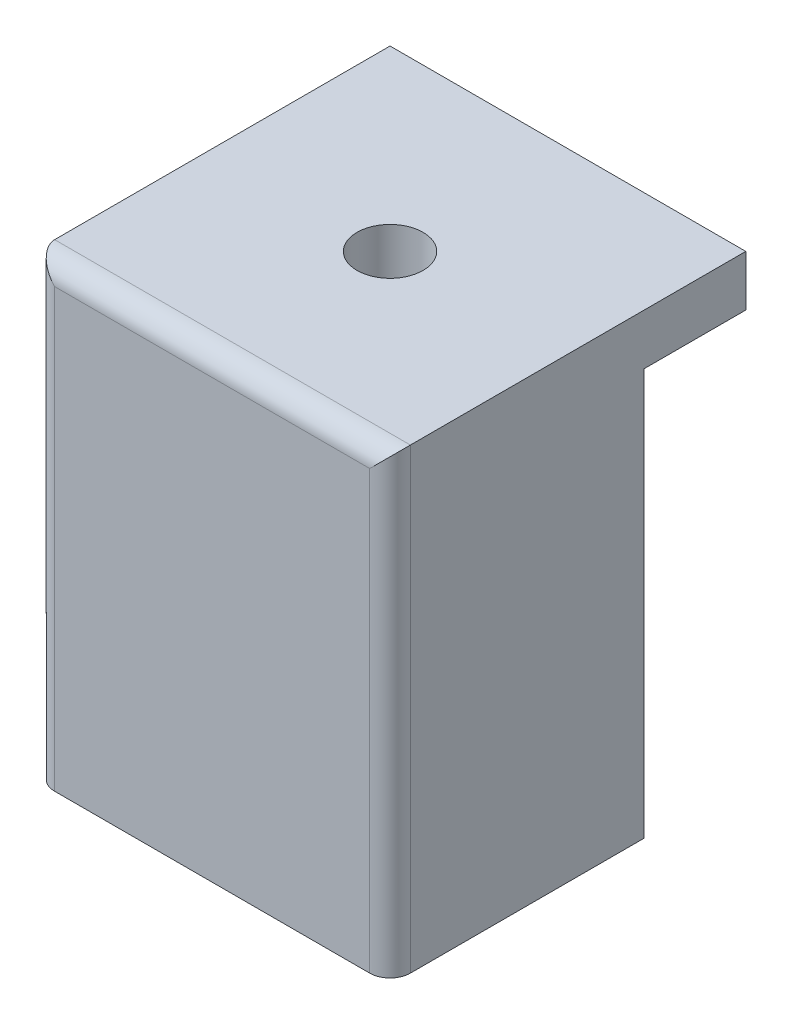
ISO-10303-21;
HEADER;
FILE_DESCRIPTION(('STEP AP214'),'2;1');
FILE_NAME('part.step','',(''),(''),'','','');
FILE_SCHEMA(('AUTOMOTIVE_DESIGN { 1 0 10303 214 1 1 1 1 }'));
ENDSEC;
DATA;
#1=APPLICATION_CONTEXT('core data for automotive mechanical design processes');
#2=APPLICATION_PROTOCOL_DEFINITION('international standard','automotive_design',2000,#1);
#3=PRODUCT_CONTEXT('',#1,'mechanical');
#4=PRODUCT('Part','Part','',(#3));
#5=PRODUCT_RELATED_PRODUCT_CATEGORY('part','',(#4));
#6=PRODUCT_DEFINITION_FORMATION('','',#4);
#7=PRODUCT_DEFINITION_CONTEXT('part definition',#1,'design');
#8=PRODUCT_DEFINITION('design','',#6,#7);
#9=PRODUCT_DEFINITION_SHAPE('','',#8);
#10=(LENGTH_UNIT() NAMED_UNIT(*) SI_UNIT(.MILLI.,.METRE.));
#11=(NAMED_UNIT(*) PLANE_ANGLE_UNIT() SI_UNIT($,.RADIAN.));
#12=(NAMED_UNIT(*) SI_UNIT($,.STERADIAN.) SOLID_ANGLE_UNIT());
#13=UNCERTAINTY_MEASURE_WITH_UNIT(LENGTH_MEASURE(1.E-05),#10,'distance_accuracy_value','');
#14=(GEOMETRIC_REPRESENTATION_CONTEXT(3) GLOBAL_UNCERTAINTY_ASSIGNED_CONTEXT((#13)) GLOBAL_UNIT_ASSIGNED_CONTEXT((#10,
#11,#12)) REPRESENTATION_CONTEXT('',''));
#15=CARTESIAN_POINT('',(0.,0.,0.));
#16=DIRECTION('',(0.,0.,1.));
#17=DIRECTION('',(1.,0.,0.));
#18=AXIS2_PLACEMENT_3D('',#15,#16,#17);
#19=CARTESIAN_POINT('',(7.5,45.,-7.5));
#20=DIRECTION('',(0.,0.,1.));
#21=DIRECTION('',(1.,0.,0.));
#22=AXIS2_PLACEMENT_3D('',#19,#20,#21);
#23=PLANE('',#22);
#24=DIRECTION('',(0.,-1.,0.));
#25=VECTOR('',#24,1.);
#26=CARTESIAN_POINT('',(-7.5,45.,-7.5));
#27=LINE('',#26,#25);
#28=CARTESIAN_POINT('',(-7.5,35.,-7.5));
#29=VERTEX_POINT('',#28);
#30=CARTESIAN_POINT('',(-7.5,20.,-7.5));
#31=VERTEX_POINT('',#30);
#32=EDGE_CURVE('E261',#29,#31,#27,.T.);
#33=ORIENTED_EDGE('',*,*,#32,.T.);
#34=DIRECTION('',(-1.,0.,0.));
#35=VECTOR('',#34,1.);
#36=CARTESIAN_POINT('',(7.5,20.,-7.5));
#37=LINE('',#36,#35);
#38=CARTESIAN_POINT('',(7.5,20.,-7.5));
#39=VERTEX_POINT('',#38);
#40=EDGE_CURVE('E201',#39,#31,#37,.T.);
#41=ORIENTED_EDGE('',*,*,#40,.F.);
#42=DIRECTION('',(0.,-1.,0.));
#43=VECTOR('',#42,1.);
#44=CARTESIAN_POINT('',(7.5,45.,-7.5));
#45=LINE('',#44,#43);
#46=CARTESIAN_POINT('',(7.5,35.,-7.5));
#47=VERTEX_POINT('',#46);
#48=EDGE_CURVE('E255',#47,#39,#45,.T.);
#49=ORIENTED_EDGE('',*,*,#48,.F.);
#50=DIRECTION('',(1.,0.,0.));
#51=VECTOR('',#50,1.);
#52=CARTESIAN_POINT('',(7.5,35.,-7.5));
#53=LINE('',#52,#51);
#54=EDGE_CURVE('E219',#29,#47,#53,.T.);
#55=ORIENTED_EDGE('',*,*,#54,.F.);
#56=EDGE_LOOP('',(#33,#41,#49,#55));
#57=FACE_BOUND('',#56,.T.);
#58=DIRECTION('',(-1.,0.,0.));
#59=VECTOR('',#58,1.);
#60=CARTESIAN_POINT('',(17.5,40.,-7.5));
#61=LINE('',#60,#59);
#62=CARTESIAN_POINT('',(17.5,40.,-7.5));
#63=VERTEX_POINT('',#62);
#64=CARTESIAN_POINT('',(-17.5,40.,-7.49999999999999));
#65=VERTEX_POINT('',#64);
#66=EDGE_CURVE('E176',#63,#65,#61,.T.);
#67=ORIENTED_EDGE('',*,*,#66,.F.);
#68=DIRECTION('',(0.,-1.,0.));
#69=VECTOR('',#68,1.);
#70=CARTESIAN_POINT('',(17.5,45.,-7.5));
#71=LINE('',#70,#69);
#72=CARTESIAN_POINT('',(17.5,0.,-7.5));
#73=VERTEX_POINT('',#72);
#74=EDGE_CURVE('E181',#63,#73,#71,.T.);
#75=ORIENTED_EDGE('',*,*,#74,.T.);
#76=DIRECTION('',(-1.,0.,0.));
#77=VECTOR('',#76,1.);
#78=CARTESIAN_POINT('',(7.5,0.,-7.5));
#79=LINE('',#78,#77);
#80=CARTESIAN_POINT('',(7.5,0.,-7.5));
#81=VERTEX_POINT('',#80);
#82=EDGE_CURVE('E232',#73,#81,#79,.T.);
#83=ORIENTED_EDGE('',*,*,#82,.T.);
#84=CARTESIAN_POINT('',(7.5,9.99999999999999,-7.5));
#85=VERTEX_POINT('',#84);
#86=EDGE_CURVE('E234',#85,#81,#45,.T.);
#87=ORIENTED_EDGE('',*,*,#86,.F.);
#88=DIRECTION('',(1.,0.,0.));
#89=VECTOR('',#88,1.);
#90=CARTESIAN_POINT('',(7.5,9.99999999999999,-7.5));
#91=LINE('',#90,#89);
#92=CARTESIAN_POINT('',(-7.5,10.,-7.5));
#93=VERTEX_POINT('',#92);
#94=EDGE_CURVE('E197',#93,#85,#91,.T.);
#95=ORIENTED_EDGE('',*,*,#94,.F.);
#96=CARTESIAN_POINT('',(-7.5,0.,-7.5));
#97=VERTEX_POINT('',#96);
#98=EDGE_CURVE('E260',#93,#97,#27,.T.);
#99=ORIENTED_EDGE('',*,*,#98,.T.);
#100=DIRECTION('',(-1.,0.,0.));
#101=VECTOR('',#100,1.);
#102=CARTESIAN_POINT('',(-17.5,0.,-7.5));
#103=LINE('',#102,#101);
#104=CARTESIAN_POINT('',(-17.5,0.,-7.5));
#105=VERTEX_POINT('',#104);
#106=EDGE_CURVE('E243',#97,#105,#103,.T.);
#107=ORIENTED_EDGE('',*,*,#106,.T.);
#108=DIRECTION('',(0.,-1.,0.));
#109=VECTOR('',#108,1.);
#110=CARTESIAN_POINT('',(-17.5,45.,-7.5));
#111=LINE('',#110,#109);
#112=EDGE_CURVE('E258',#65,#105,#111,.T.);
#113=ORIENTED_EDGE('',*,*,#112,.F.);
#114=EDGE_LOOP('',(#67,#75,#83,#87,#95,#99,#107,#113));
#115=FACE_BOUND('',#114,.T.);
#116=ADVANCED_FACE('F41',(#57,#115),#23,.F.);
#117=CARTESIAN_POINT('',(7.5,45.,-7.5));
#118=DIRECTION('',(1.,0.,0.));
#119=DIRECTION('',(0.,0.,-1.));
#120=AXIS2_PLACEMENT_3D('',#117,#118,#119);
#121=PLANE('',#120);
#122=DIRECTION('',(0.,0.,1.));
#123=VECTOR('',#122,1.);
#124=CARTESIAN_POINT('',(7.5,20.,-25.5277563773199));
#125=LINE('',#124,#123);
#126=CARTESIAN_POINT('',(7.5,20.,7.5));
#127=VERTEX_POINT('',#126);
#128=EDGE_CURVE('E207',#39,#127,#125,.T.);
#129=ORIENTED_EDGE('',*,*,#128,.T.);
#130=DIRECTION('',(0.,-1.,0.));
#131=VECTOR('',#130,1.);
#132=CARTESIAN_POINT('',(7.5,45.,7.5));
#133=LINE('',#132,#131);
#134=CARTESIAN_POINT('',(7.5,35.,7.5));
#135=VERTEX_POINT('',#134);
#136=EDGE_CURVE('E269',#135,#127,#133,.T.);
#137=ORIENTED_EDGE('',*,*,#136,.F.);
#138=DIRECTION('',(0.,0.,1.));
#139=VECTOR('',#138,1.);
#140=CARTESIAN_POINT('',(7.5,35.,-25.5277563773199));
#141=LINE('',#140,#139);
#142=EDGE_CURVE('E222',#47,#135,#141,.T.);
#143=ORIENTED_EDGE('',*,*,#142,.F.);
#144=ORIENTED_EDGE('',*,*,#48,.T.);
#145=EDGE_LOOP('',(#129,#137,#143,#144));
#146=FACE_BOUND('',#145,.T.);
#147=ADVANCED_FACE('F308',(#146),#121,.F.);
#148=DIRECTION('',(0.,0.,1.));
#149=VECTOR('',#148,1.);
#150=CARTESIAN_POINT('',(7.5,9.99999999999999,-25.5277563773199));
#151=LINE('',#150,#149);
#152=CARTESIAN_POINT('',(7.5,10.,7.5));
#153=VERTEX_POINT('',#152);
#154=EDGE_CURVE('E214',#85,#153,#151,.T.);
#155=ORIENTED_EDGE('',*,*,#154,.F.);
#156=ORIENTED_EDGE('',*,*,#86,.T.);
#157=DIRECTION('',(0.,0.,1.));
#158=VECTOR('',#157,1.);
#159=CARTESIAN_POINT('',(7.5,0.,-7.5));
#160=LINE('',#159,#158);
#161=CARTESIAN_POINT('',(7.5,0.,7.5));
#162=VERTEX_POINT('',#161);
#163=EDGE_CURVE('E221',#81,#162,#160,.T.);
#164=ORIENTED_EDGE('',*,*,#163,.T.);
#165=EDGE_CURVE('E268',#153,#162,#133,.T.);
#166=ORIENTED_EDGE('',*,*,#165,.F.);
#167=EDGE_LOOP('',(#155,#156,#164,#166));
#168=FACE_BOUND('',#167,.T.);
#169=ADVANCED_FACE('F314',(#168),#121,.F.);
#170=CARTESIAN_POINT('',(-7.5,45.,7.5));
#171=DIRECTION('',(0.,0.,1.));
#172=DIRECTION('',(1.,0.,0.));
#173=AXIS2_PLACEMENT_3D('',#170,#171,#172);
#174=PLANE('',#173);
#175=DIRECTION('',(1.,0.,0.));
#176=VECTOR('',#175,1.);
#177=CARTESIAN_POINT('',(7.5,20.,7.5));
#178=LINE('',#177,#176);
#179=CARTESIAN_POINT('',(-7.5,20.,7.5));
#180=VERTEX_POINT('',#179);
#181=EDGE_CURVE('E204',#180,#127,#178,.T.);
#182=ORIENTED_EDGE('',*,*,#181,.F.);
#183=DIRECTION('',(0.,-1.,0.));
#184=VECTOR('',#183,1.);
#185=CARTESIAN_POINT('',(-7.5,45.,7.5));
#186=LINE('',#185,#184);
#187=CARTESIAN_POINT('',(-7.5,35.,7.5));
#188=VERTEX_POINT('',#187);
#189=EDGE_CURVE('E265',#188,#180,#186,.T.);
#190=ORIENTED_EDGE('',*,*,#189,.F.);
#191=DIRECTION('',(-1.,0.,0.));
#192=VECTOR('',#191,1.);
#193=CARTESIAN_POINT('',(7.5,35.,7.5));
#194=LINE('',#193,#192);
#195=EDGE_CURVE('E200',#135,#188,#194,.T.);
#196=ORIENTED_EDGE('',*,*,#195,.F.);
#197=ORIENTED_EDGE('',*,*,#136,.T.);
#198=EDGE_LOOP('',(#182,#190,#196,#197));
#199=FACE_BOUND('',#198,.T.);
#200=ADVANCED_FACE('F336',(#199),#174,.F.);
#201=DIRECTION('',(-1.,0.,0.));
#202=VECTOR('',#201,1.);
#203=CARTESIAN_POINT('',(7.5,9.99999999999999,7.5));
#204=LINE('',#203,#202);
#205=CARTESIAN_POINT('',(-7.5,10.,7.5));
#206=VERTEX_POINT('',#205);
#207=EDGE_CURVE('E196',#153,#206,#204,.T.);
#208=ORIENTED_EDGE('',*,*,#207,.F.);
#209=ORIENTED_EDGE('',*,*,#165,.T.);
#210=DIRECTION('',(-1.,0.,0.));
#211=VECTOR('',#210,1.);
#212=CARTESIAN_POINT('',(-7.5,0.,7.5));
#213=LINE('',#212,#211);
#214=CARTESIAN_POINT('',(-7.5,0.,7.5));
#215=VERTEX_POINT('',#214);
#216=EDGE_CURVE('E237',#162,#215,#213,.T.);
#217=ORIENTED_EDGE('',*,*,#216,.T.);
#218=EDGE_CURVE('E264',#206,#215,#186,.T.);
#219=ORIENTED_EDGE('',*,*,#218,.F.);
#220=EDGE_LOOP('',(#208,#209,#217,#219));
#221=FACE_BOUND('',#220,.T.);
#222=ADVANCED_FACE('F334',(#221),#174,.F.);
#223=CARTESIAN_POINT('',(-7.5,45.,-7.5));
#224=DIRECTION('',(-1.,0.,0.));
#225=DIRECTION('',(0.,0.,1.));
#226=AXIS2_PLACEMENT_3D('',#223,#224,#225);
#227=PLANE('',#226);
#228=DIRECTION('',(0.,0.,1.));
#229=VECTOR('',#228,1.);
#230=CARTESIAN_POINT('',(-7.5,20.,-25.5277563773199));
#231=LINE('',#230,#229);
#232=EDGE_CURVE('E209',#31,#180,#231,.T.);
#233=ORIENTED_EDGE('',*,*,#232,.F.);
#234=ORIENTED_EDGE('',*,*,#32,.F.);
#235=DIRECTION('',(0.,0.,1.));
#236=VECTOR('',#235,1.);
#237=CARTESIAN_POINT('',(-7.5,35.,-25.5277563773199));
#238=LINE('',#237,#236);
#239=EDGE_CURVE('E224',#29,#188,#238,.T.);
#240=ORIENTED_EDGE('',*,*,#239,.T.);
#241=ORIENTED_EDGE('',*,*,#189,.T.);
#242=EDGE_LOOP('',(#233,#234,#240,#241));
#243=FACE_BOUND('',#242,.T.);
#244=ADVANCED_FACE('F331',(#243),#227,.F.);
#245=DIRECTION('',(0.,0.,1.));
#246=VECTOR('',#245,1.);
#247=CARTESIAN_POINT('',(-7.5,9.99999999999999,-25.5277563773199));
#248=LINE('',#247,#246);
#249=EDGE_CURVE('E212',#93,#206,#248,.T.);
#250=ORIENTED_EDGE('',*,*,#249,.T.);
#251=ORIENTED_EDGE('',*,*,#218,.T.);
#252=DIRECTION('',(0.,0.,-1.));
#253=VECTOR('',#252,1.);
#254=CARTESIAN_POINT('',(-7.5,0.,-7.5));
#255=LINE('',#254,#253);
#256=EDGE_CURVE('E240',#215,#97,#255,.T.);
#257=ORIENTED_EDGE('',*,*,#256,.T.);
#258=ORIENTED_EDGE('',*,*,#98,.F.);
#259=EDGE_LOOP('',(#250,#251,#257,#258));
#260=FACE_BOUND('',#259,.T.);
#261=ADVANCED_FACE('F330',(#260),#227,.F.);
#262=CARTESIAN_POINT('',(-17.5,45.,-7.5));
#263=DIRECTION('',(1.,0.,0.));
#264=DIRECTION('',(0.,0.,-1.));
#265=AXIS2_PLACEMENT_3D('',#262,#263,#264);
#266=PLANE('',#265);
#267=DIRECTION('',(0.,0.,1.));
#268=VECTOR('',#267,1.);
#269=CARTESIAN_POINT('',(-17.5,0.,-7.5));
#270=LINE('',#269,#268);
#271=CARTESIAN_POINT('',(-17.5,0.,15.5));
#272=VERTEX_POINT('',#271);
#273=EDGE_CURVE('E246',#105,#272,#270,.T.);
#274=ORIENTED_EDGE('',*,*,#273,.T.);
#275=DIRECTION('',(0.,-1.,0.));
#276=VECTOR('',#275,1.);
#277=CARTESIAN_POINT('',(-17.5,45.,15.5));
#278=LINE('',#277,#276);
#279=CARTESIAN_POINT('',(-17.5,45.,15.5));
#280=VERTEX_POINT('',#279);
#281=EDGE_CURVE('E50',#272,#280,#278,.F.);
#282=ORIENTED_EDGE('',*,*,#281,.T.);
#283=DIRECTION('',(0.,0.,1.));
#284=VECTOR('',#283,1.);
#285=CARTESIAN_POINT('',(-17.5,45.,-7.5));
#286=LINE('',#285,#284);
#287=CARTESIAN_POINT('',(-17.5,45.,-17.5));
#288=VERTEX_POINT('',#287);
#289=EDGE_CURVE('E228',#288,#280,#286,.T.);
#290=ORIENTED_EDGE('',*,*,#289,.F.);
#291=DIRECTION('',(0.,1.,0.));
#292=VECTOR('',#291,1.);
#293=CARTESIAN_POINT('',(-17.5,45.,-17.5));
#294=LINE('',#293,#292);
#295=CARTESIAN_POINT('',(-17.5,40.,-17.5));
#296=VERTEX_POINT('',#295);
#297=EDGE_CURVE('E168',#296,#288,#294,.T.);
#298=ORIENTED_EDGE('',*,*,#297,.F.);
#299=DIRECTION('',(0.,0.,1.));
#300=VECTOR('',#299,1.);
#301=CARTESIAN_POINT('',(-17.5,40.,-17.5));
#302=LINE('',#301,#300);
#303=EDGE_CURVE('E164',#296,#65,#302,.T.);
#304=ORIENTED_EDGE('',*,*,#303,.T.);
#305=ORIENTED_EDGE('',*,*,#112,.T.);
#306=EDGE_LOOP('',(#274,#282,#290,#298,#304,#305));
#307=FACE_BOUND('',#306,.T.);
#308=ADVANCED_FACE('F326',(#307),#266,.F.);
#309=CARTESIAN_POINT('',(-17.5,45.,17.5));
#310=DIRECTION('',(0.,0.,-1.));
#311=DIRECTION('',(-1.,0.,0.));
#312=AXIS2_PLACEMENT_3D('',#309,#310,#311);
#313=PLANE('',#312);
#314=DIRECTION('',(1.,0.,0.));
#315=VECTOR('',#314,1.);
#316=CARTESIAN_POINT('',(-17.5,43.,17.5));
#317=LINE('',#316,#315);
#318=CARTESIAN_POINT('',(15.5,43.,17.5));
#319=VERTEX_POINT('',#318);
#320=CARTESIAN_POINT('',(-15.5,43.,17.5));
#321=VERTEX_POINT('',#320);
#322=EDGE_CURVE('E279',#319,#321,#317,.F.);
#323=ORIENTED_EDGE('',*,*,#322,.T.);
#324=DIRECTION('',(0.,-1.,0.));
#325=VECTOR('',#324,1.);
#326=CARTESIAN_POINT('',(-15.5,45.,17.5));
#327=LINE('',#326,#325);
#328=CARTESIAN_POINT('',(-15.5,0.,17.5));
#329=VERTEX_POINT('',#328);
#330=EDGE_CURVE('E281',#321,#329,#327,.T.);
#331=ORIENTED_EDGE('',*,*,#330,.T.);
#332=DIRECTION('',(1.,0.,0.));
#333=VECTOR('',#332,1.);
#334=CARTESIAN_POINT('',(-17.5,0.,17.5));
#335=LINE('',#334,#333);
#336=CARTESIAN_POINT('',(15.5,0.,17.5));
#337=VERTEX_POINT('',#336);
#338=EDGE_CURVE('E248',#329,#337,#335,.T.);
#339=ORIENTED_EDGE('',*,*,#338,.T.);
#340=DIRECTION('',(0.,-1.,0.));
#341=VECTOR('',#340,1.);
#342=CARTESIAN_POINT('',(15.5,45.,17.5));
#343=LINE('',#342,#341);
#344=EDGE_CURVE('E277',#337,#319,#343,.F.);
#345=ORIENTED_EDGE('',*,*,#344,.T.);
#346=EDGE_LOOP('',(#323,#331,#339,#345));
#347=FACE_BOUND('',#346,.T.);
#348=ADVANCED_FACE('F323',(#347),#313,.F.);
#349=CARTESIAN_POINT('',(17.5,45.,-7.5));
#350=DIRECTION('',(-1.,0.,0.));
#351=DIRECTION('',(0.,0.,1.));
#352=AXIS2_PLACEMENT_3D('',#349,#350,#351);
#353=PLANE('',#352);
#354=DIRECTION('',(0.,0.,-1.));
#355=VECTOR('',#354,1.);
#356=CARTESIAN_POINT('',(17.5,45.,-7.5));
#357=LINE('',#356,#355);
#358=CARTESIAN_POINT('',(17.5,45.,15.5));
#359=VERTEX_POINT('',#358);
#360=CARTESIAN_POINT('',(17.5,45.,-17.5));
#361=VERTEX_POINT('',#360);
#362=EDGE_CURVE('E231',#359,#361,#357,.T.);
#363=ORIENTED_EDGE('',*,*,#362,.F.);
#364=DIRECTION('',(0.,-1.,0.));
#365=VECTOR('',#364,1.);
#366=CARTESIAN_POINT('',(17.5,45.,15.5));
#367=LINE('',#366,#365);
#368=CARTESIAN_POINT('',(17.5,0.,15.5));
#369=VERTEX_POINT('',#368);
#370=EDGE_CURVE('E11',#359,#369,#367,.T.);
#371=ORIENTED_EDGE('',*,*,#370,.T.);
#372=DIRECTION('',(0.,0.,-1.));
#373=VECTOR('',#372,1.);
#374=CARTESIAN_POINT('',(17.5,0.,-7.5));
#375=LINE('',#374,#373);
#376=EDGE_CURVE('E251',#369,#73,#375,.T.);
#377=ORIENTED_EDGE('',*,*,#376,.T.);
#378=ORIENTED_EDGE('',*,*,#74,.F.);
#379=DIRECTION('',(0.,0.,1.));
#380=VECTOR('',#379,1.);
#381=CARTESIAN_POINT('',(17.5,40.,-17.5));
#382=LINE('',#381,#380);
#383=CARTESIAN_POINT('',(17.5,40.,-17.5));
#384=VERTEX_POINT('',#383);
#385=EDGE_CURVE('E162',#384,#63,#382,.T.);
#386=ORIENTED_EDGE('',*,*,#385,.F.);
#387=DIRECTION('',(0.,-1.,0.));
#388=VECTOR('',#387,1.);
#389=CARTESIAN_POINT('',(17.5,45.,-17.5));
#390=LINE('',#389,#388);
#391=EDGE_CURVE('E169',#361,#384,#390,.T.);
#392=ORIENTED_EDGE('',*,*,#391,.F.);
#393=EDGE_LOOP('',(#363,#371,#377,#378,#386,#392));
#394=FACE_BOUND('',#393,.T.);
#395=ADVANCED_FACE('F179',(#394),#353,.F.);
#396=CARTESIAN_POINT('',(0.,45.,0.));
#397=DIRECTION('',(0.,1.,0.));
#398=DIRECTION('',(0.,0.,1.));
#399=AXIS2_PLACEMENT_3D('',#396,#397,#398);
#400=PLANE('',#399);
#401=CARTESIAN_POINT('',(0.,45.,0.));
#402=DIRECTION('',(0.,1.,0.));
#403=DIRECTION('',(0.,0.,1.));
#404=AXIS2_PLACEMENT_3D('',#401,#402,#403);
#405=CIRCLE('',#404,3.25000000000001);
#406=CARTESIAN_POINT('',(0.,45.,3.25000000000001));
#407=VERTEX_POINT('',#406);
#408=EDGE_CURVE('E182',#407,#407,#405,.T.);
#409=ORIENTED_EDGE('',*,*,#408,.F.);
#410=EDGE_LOOP('',(#409));
#411=FACE_BOUND('',#410,.T.);
#412=ORIENTED_EDGE('',*,*,#289,.T.);
#413=DIRECTION('',(1.,0.,0.));
#414=VECTOR('',#413,1.);
#415=CARTESIAN_POINT('',(17.5,45.,15.5));
#416=LINE('',#415,#414);
#417=EDGE_CURVE('E272',#280,#359,#416,.T.);
#418=ORIENTED_EDGE('',*,*,#417,.T.);
#419=ORIENTED_EDGE('',*,*,#362,.T.);
#420=DIRECTION('',(1.,0.,0.));
#421=VECTOR('',#420,1.);
#422=CARTESIAN_POINT('',(17.5,45.,-17.5));
#423=LINE('',#422,#421);
#424=EDGE_CURVE('E175',#288,#361,#423,.T.);
#425=ORIENTED_EDGE('',*,*,#424,.F.);
#426=EDGE_LOOP('',(#412,#418,#419,#425));
#427=FACE_BOUND('',#426,.T.);
#428=ADVANCED_FACE('F297',(#411,#427),#400,.T.);
#429=CARTESIAN_POINT('',(0.,0.,0.));
#430=DIRECTION('',(0.,1.,0.));
#431=DIRECTION('',(0.,0.,1.));
#432=AXIS2_PLACEMENT_3D('',#429,#430,#431);
#433=PLANE('',#432);
#434=ORIENTED_EDGE('',*,*,#338,.F.);
#435=CARTESIAN_POINT('',(-15.5,0.,15.5));
#436=DIRECTION('',(0.,1.,0.));
#437=DIRECTION('',(0.,0.,1.));
#438=AXIS2_PLACEMENT_3D('',#435,#436,#437);
#439=CIRCLE('',#438,2.);
#440=EDGE_CURVE('E58',#329,#272,#439,.F.);
#441=ORIENTED_EDGE('',*,*,#440,.T.);
#442=ORIENTED_EDGE('',*,*,#273,.F.);
#443=ORIENTED_EDGE('',*,*,#106,.F.);
#444=ORIENTED_EDGE('',*,*,#256,.F.);
#445=ORIENTED_EDGE('',*,*,#216,.F.);
#446=ORIENTED_EDGE('',*,*,#163,.F.);
#447=ORIENTED_EDGE('',*,*,#82,.F.);
#448=ORIENTED_EDGE('',*,*,#376,.F.);
#449=CARTESIAN_POINT('',(15.5,0.,15.5));
#450=DIRECTION('',(0.,1.,0.));
#451=DIRECTION('',(0.,0.,1.));
#452=AXIS2_PLACEMENT_3D('',#449,#450,#451);
#453=CIRCLE('',#452,2.);
#454=EDGE_CURVE('E283',#369,#337,#453,.F.);
#455=ORIENTED_EDGE('',*,*,#454,.T.);
#456=EDGE_LOOP('',(#434,#441,#442,#443,#444,#445,#446,#447,#448,#455));
#457=FACE_BOUND('',#456,.T.);
#458=ADVANCED_FACE('F319',(#457),#433,.F.);
#459=CARTESIAN_POINT('',(7.5,35.,-25.5277563773199));
#460=DIRECTION('',(0.,1.,0.));
#461=DIRECTION('',(0.,0.,1.));
#462=AXIS2_PLACEMENT_3D('',#459,#460,#461);
#463=PLANE('',#462);
#464=CARTESIAN_POINT('',(0.,35.,0.));
#465=DIRECTION('',(0.,1.,0.));
#466=DIRECTION('',(0.,0.,1.));
#467=AXIS2_PLACEMENT_3D('',#464,#465,#466);
#468=CIRCLE('',#467,3.25000000000001);
#469=CARTESIAN_POINT('',(0.,35.,3.25000000000001));
#470=VERTEX_POINT('',#469);
#471=EDGE_CURVE('E193',#470,#470,#468,.T.);
#472=ORIENTED_EDGE('',*,*,#471,.T.);
#473=EDGE_LOOP('',(#472));
#474=FACE_BOUND('',#473,.T.);
#475=ORIENTED_EDGE('',*,*,#239,.F.);
#476=ORIENTED_EDGE('',*,*,#54,.T.);
#477=ORIENTED_EDGE('',*,*,#142,.T.);
#478=ORIENTED_EDGE('',*,*,#195,.T.);
#479=EDGE_LOOP('',(#475,#476,#477,#478));
#480=FACE_BOUND('',#479,.T.);
#481=ADVANCED_FACE('F357',(#474,#480),#463,.F.);
#482=CARTESIAN_POINT('',(7.5,20.,-25.5277563773199));
#483=DIRECTION('',(0.,-1.,0.));
#484=DIRECTION('',(0.,0.,-1.));
#485=AXIS2_PLACEMENT_3D('',#482,#483,#484);
#486=PLANE('',#485);
#487=CARTESIAN_POINT('',(0.,20.,0.));
#488=DIRECTION('',(0.,-1.,0.));
#489=DIRECTION('',(0.,0.,-1.));
#490=AXIS2_PLACEMENT_3D('',#487,#488,#489);
#491=CIRCLE('',#490,3.25000000000001);
#492=CARTESIAN_POINT('',(0.,20.,-3.25000000000001));
#493=VERTEX_POINT('',#492);
#494=EDGE_CURVE('E190',#493,#493,#491,.T.);
#495=ORIENTED_EDGE('',*,*,#494,.T.);
#496=EDGE_LOOP('',(#495));
#497=FACE_BOUND('',#496,.T.);
#498=ORIENTED_EDGE('',*,*,#128,.F.);
#499=ORIENTED_EDGE('',*,*,#40,.T.);
#500=ORIENTED_EDGE('',*,*,#232,.T.);
#501=ORIENTED_EDGE('',*,*,#181,.T.);
#502=EDGE_LOOP('',(#498,#499,#500,#501));
#503=FACE_BOUND('',#502,.T.);
#504=ADVANCED_FACE('F352',(#497,#503),#486,.F.);
#505=CARTESIAN_POINT('',(7.5,9.99999999999999,-25.5277563773199));
#506=DIRECTION('',(0.,1.,0.));
#507=DIRECTION('',(0.,0.,1.));
#508=AXIS2_PLACEMENT_3D('',#505,#506,#507);
#509=PLANE('',#508);
#510=CARTESIAN_POINT('',(0.,9.99999999999999,0.));
#511=DIRECTION('',(0.,1.,0.));
#512=DIRECTION('',(0.,0.,1.));
#513=AXIS2_PLACEMENT_3D('',#510,#511,#512);
#514=CIRCLE('',#513,3.25000000000001);
#515=CARTESIAN_POINT('',(0.,9.99999999999999,3.25000000000001));
#516=VERTEX_POINT('',#515);
#517=EDGE_CURVE('E185',#516,#516,#514,.T.);
#518=ORIENTED_EDGE('',*,*,#517,.T.);
#519=EDGE_LOOP('',(#518));
#520=FACE_BOUND('',#519,.T.);
#521=ORIENTED_EDGE('',*,*,#249,.F.);
#522=ORIENTED_EDGE('',*,*,#94,.T.);
#523=ORIENTED_EDGE('',*,*,#154,.T.);
#524=ORIENTED_EDGE('',*,*,#207,.T.);
#525=EDGE_LOOP('',(#521,#522,#523,#524));
#526=FACE_BOUND('',#525,.T.);
#527=ADVANCED_FACE('F365',(#520,#526),#509,.F.);
#528=CARTESIAN_POINT('',(0.,-9.19238815542514,0.));
#529=DIRECTION('',(0.,1.,0.));
#530=DIRECTION('',(0.,0.,1.));
#531=AXIS2_PLACEMENT_3D('',#528,#529,#530);
#532=CYLINDRICAL_SURFACE('',#531,3.25000000000001);
#533=ORIENTED_EDGE('',*,*,#517,.F.);
#534=EDGE_LOOP('',(#533));
#535=FACE_BOUND('',#534,.T.);
#536=ORIENTED_EDGE('',*,*,#494,.F.);
#537=EDGE_LOOP('',(#536));
#538=FACE_BOUND('',#537,.T.);
#539=ADVANCED_FACE('F379',(#535,#538),#532,.F.);
#540=ORIENTED_EDGE('',*,*,#408,.T.);
#541=EDGE_LOOP('',(#540));
#542=FACE_BOUND('',#541,.T.);
#543=ORIENTED_EDGE('',*,*,#471,.F.);
#544=EDGE_LOOP('',(#543));
#545=FACE_BOUND('',#544,.T.);
#546=ADVANCED_FACE('F376',(#542,#545),#532,.F.);
#547=CARTESIAN_POINT('',(17.5,40.,-17.5));
#548=DIRECTION('',(0.,1.,0.));
#549=DIRECTION('',(0.,0.,1.));
#550=AXIS2_PLACEMENT_3D('',#547,#548,#549);
#551=PLANE('',#550);
#552=ORIENTED_EDGE('',*,*,#66,.T.);
#553=ORIENTED_EDGE('',*,*,#303,.F.);
#554=DIRECTION('',(-1.,0.,0.));
#555=VECTOR('',#554,1.);
#556=CARTESIAN_POINT('',(17.5,40.,-17.5));
#557=LINE('',#556,#555);
#558=EDGE_CURVE('E157',#384,#296,#557,.T.);
#559=ORIENTED_EDGE('',*,*,#558,.F.);
#560=ORIENTED_EDGE('',*,*,#385,.T.);
#561=EDGE_LOOP('',(#552,#553,#559,#560));
#562=FACE_BOUND('',#561,.T.);
#563=ADVANCED_FACE('F160',(#562),#551,.F.);
#564=CARTESIAN_POINT('',(0.,0.,-17.5));
#565=DIRECTION('',(0.,0.,-1.));
#566=DIRECTION('',(-1.,0.,0.));
#567=AXIS2_PLACEMENT_3D('',#564,#565,#566);
#568=PLANE('',#567);
#569=ORIENTED_EDGE('',*,*,#391,.T.);
#570=ORIENTED_EDGE('',*,*,#558,.T.);
#571=ORIENTED_EDGE('',*,*,#297,.T.);
#572=ORIENTED_EDGE('',*,*,#424,.T.);
#573=EDGE_LOOP('',(#569,#570,#571,#572));
#574=FACE_BOUND('',#573,.T.);
#575=ADVANCED_FACE('F173',(#574),#568,.T.);
#576=CARTESIAN_POINT('',(-15.5,45.,15.5));
#577=DIRECTION('',(0.,-1.,0.));
#578=DIRECTION('',(0.,0.,-1.));
#579=AXIS2_PLACEMENT_3D('',#576,#577,#578);
#580=CYLINDRICAL_SURFACE('',#579,2.);
#581=ORIENTED_EDGE('',*,*,#440,.F.);
#582=ORIENTED_EDGE('',*,*,#330,.F.);
#583=CARTESIAN_POINT('',(-15.5,43.,15.5));
#584=DIRECTION('',(-0.707106781186547,-0.707106781186547,0.));
#585=DIRECTION('',(0.707106781186547,-0.707106781186547,0.));
#586=AXIS2_PLACEMENT_3D('',#583,#584,#585);
#587=ELLIPSE('',#586,2.82842712474619,2.);
#588=EDGE_CURVE('E45',#280,#321,#587,.F.);
#589=ORIENTED_EDGE('',*,*,#588,.F.);
#590=ORIENTED_EDGE('',*,*,#281,.F.);
#591=EDGE_LOOP('',(#581,#582,#589,#590));
#592=FACE_BOUND('',#591,.T.);
#593=ADVANCED_FACE('F43',(#592),#580,.T.);
#594=CARTESIAN_POINT('',(15.5,45.,15.5));
#595=DIRECTION('',(0.,-1.,0.));
#596=DIRECTION('',(0.,0.,-1.));
#597=AXIS2_PLACEMENT_3D('',#594,#595,#596);
#598=CYLINDRICAL_SURFACE('',#597,2.);
#599=ORIENTED_EDGE('',*,*,#454,.F.);
#600=ORIENTED_EDGE('',*,*,#370,.F.);
#601=CARTESIAN_POINT('',(15.5,43.,15.5));
#602=DIRECTION('',(0.707106781186547,-0.707106781186547,0.));
#603=DIRECTION('',(-0.707106781186547,-0.707106781186547,0.));
#604=AXIS2_PLACEMENT_3D('',#601,#602,#603);
#605=ELLIPSE('',#604,2.82842712474619,2.);
#606=EDGE_CURVE('E286',#319,#359,#605,.F.);
#607=ORIENTED_EDGE('',*,*,#606,.F.);
#608=ORIENTED_EDGE('',*,*,#344,.F.);
#609=EDGE_LOOP('',(#599,#600,#607,#608));
#610=FACE_BOUND('',#609,.T.);
#611=ADVANCED_FACE('F300',(#610),#598,.T.);
#612=CARTESIAN_POINT('',(0.,43.,15.5));
#613=DIRECTION('',(-1.,0.,0.));
#614=DIRECTION('',(0.,0.,1.));
#615=AXIS2_PLACEMENT_3D('',#612,#613,#614);
#616=CYLINDRICAL_SURFACE('',#615,2.);
#617=ORIENTED_EDGE('',*,*,#588,.T.);
#618=ORIENTED_EDGE('',*,*,#322,.F.);
#619=ORIENTED_EDGE('',*,*,#606,.T.);
#620=ORIENTED_EDGE('',*,*,#417,.F.);
#621=EDGE_LOOP('',(#617,#618,#619,#620));
#622=FACE_BOUND('',#621,.T.);
#623=ADVANCED_FACE('F298',(#622),#616,.T.);
#624=CLOSED_SHELL('',(#116,#147,#169,#200,#222,#244,#261,#308,#348,#395,#428,#458,#481,#504,
#527,#539,#546,#563,#575,#593,#611,#623));
#625=MANIFOLD_SOLID_BREP('B2',#624);
#626=ADVANCED_BREP_SHAPE_REPRESENTATION('',(#18,#625),#14);
#627=SHAPE_DEFINITION_REPRESENTATION(#9,#626);
ENDSEC;
END-ISO-10303-21;
